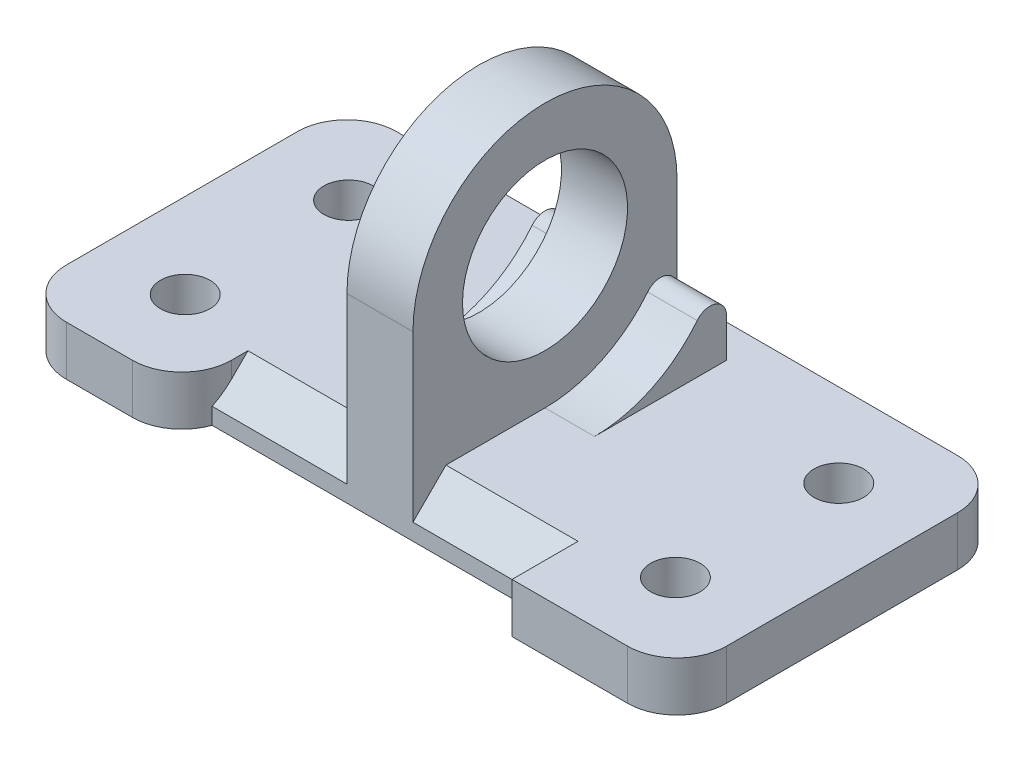
ISO-10303-21;
HEADER;
FILE_DESCRIPTION(('STEP AP214'),'2;1');
FILE_NAME('part.step','',(''),(''),'','','');
FILE_SCHEMA(('AUTOMOTIVE_DESIGN { 1 0 10303 214 1 1 1 1 }'));
ENDSEC;
DATA;
#1=APPLICATION_CONTEXT('core data for automotive mechanical design processes');
#2=APPLICATION_PROTOCOL_DEFINITION('international standard','automotive_design',2000,#1);
#3=PRODUCT_CONTEXT('',#1,'mechanical');
#4=PRODUCT('Part','Part','',(#3));
#5=PRODUCT_RELATED_PRODUCT_CATEGORY('part','',(#4));
#6=PRODUCT_DEFINITION_FORMATION('','',#4);
#7=PRODUCT_DEFINITION_CONTEXT('part definition',#1,'design');
#8=PRODUCT_DEFINITION('design','',#6,#7);
#9=PRODUCT_DEFINITION_SHAPE('','',#8);
#10=(LENGTH_UNIT() NAMED_UNIT(*) SI_UNIT(.MILLI.,.METRE.));
#11=(NAMED_UNIT(*) PLANE_ANGLE_UNIT() SI_UNIT($,.RADIAN.));
#12=(NAMED_UNIT(*) SI_UNIT($,.STERADIAN.) SOLID_ANGLE_UNIT());
#13=UNCERTAINTY_MEASURE_WITH_UNIT(LENGTH_MEASURE(1.E-05),#10,'distance_accuracy_value','');
#14=(GEOMETRIC_REPRESENTATION_CONTEXT(3) GLOBAL_UNCERTAINTY_ASSIGNED_CONTEXT((#13)) GLOBAL_UNIT_ASSIGNED_CONTEXT((#10,
#11,#12)) REPRESENTATION_CONTEXT('',''));
#15=CARTESIAN_POINT('',(0.,0.,0.));
#16=DIRECTION('',(0.,0.,1.));
#17=DIRECTION('',(1.,0.,0.));
#18=AXIS2_PLACEMENT_3D('',#15,#16,#17);
#19=CARTESIAN_POINT('',(0.,0.,10.));
#20=DIRECTION('',(0.,0.,1.));
#21=DIRECTION('',(1.,0.,0.));
#22=AXIS2_PLACEMENT_3D('',#19,#20,#21);
#23=PLANE('',#22);
#24=DIRECTION('',(-1.,0.,0.));
#25=VECTOR('',#24,1.);
#26=CARTESIAN_POINT('',(-18.,3.,10.));
#27=LINE('',#26,#25);
#28=CARTESIAN_POINT('',(-13.,3.,10.));
#29=VERTEX_POINT('',#28);
#30=CARTESIAN_POINT('',(-17.,3.,10.));
#31=VERTEX_POINT('',#30);
#32=EDGE_CURVE('E216',#29,#31,#27,.T.);
#33=ORIENTED_EDGE('',*,*,#32,.T.);
#34=DIRECTION('',(0.,1.,0.));
#35=VECTOR('',#34,1.);
#36=CARTESIAN_POINT('',(-17.,0.,10.));
#37=LINE('',#36,#35);
#38=CARTESIAN_POINT('',(-17.,0.,10.));
#39=VERTEX_POINT('',#38);
#40=EDGE_CURVE('E423',#31,#39,#37,.F.);
#41=ORIENTED_EDGE('',*,*,#40,.T.);
#42=DIRECTION('',(1.,0.,0.));
#43=VECTOR('',#42,1.);
#44=CARTESIAN_POINT('',(-18.,0.,10.));
#45=LINE('',#44,#43);
#46=CARTESIAN_POINT('',(-13.,0.,10.));
#47=VERTEX_POINT('',#46);
#48=EDGE_CURVE('E265',#39,#47,#45,.T.);
#49=ORIENTED_EDGE('',*,*,#48,.T.);
#50=DIRECTION('',(0.,-1.,0.));
#51=VECTOR('',#50,1.);
#52=CARTESIAN_POINT('',(-13.,3.,10.));
#53=LINE('',#52,#51);
#54=EDGE_CURVE('E421',#47,#29,#53,.F.);
#55=ORIENTED_EDGE('',*,*,#54,.T.);
#56=EDGE_LOOP('',(#33,#41,#49,#55));
#57=FACE_BOUND('',#56,.T.);
#58=ADVANCED_FACE('F37',(#57),#23,.T.);
#59=CARTESIAN_POINT('',(-18.,3.,-8.));
#60=DIRECTION('',(0.,0.,-1.));
#61=DIRECTION('',(-1.,0.,0.));
#62=AXIS2_PLACEMENT_3D('',#59,#60,#61);
#63=PLANE('',#62);
#64=DIRECTION('',(0.,-1.,0.));
#65=VECTOR('',#64,1.);
#66=CARTESIAN_POINT('',(5.,0.,-8.));
#67=LINE('',#66,#65);
#68=CARTESIAN_POINT('',(5.,5.34314575050762,-8.));
#69=VERTEX_POINT('',#68);
#70=CARTESIAN_POINT('',(5.,3.,-8.));
#71=VERTEX_POINT('',#70);
#72=EDGE_CURVE('E302',#69,#71,#67,.T.);
#73=ORIENTED_EDGE('',*,*,#72,.T.);
#74=DIRECTION('',(1.,0.,0.));
#75=VECTOR('',#74,1.);
#76=CARTESIAN_POINT('',(-18.,3.,-8.));
#77=LINE('',#76,#75);
#78=CARTESIAN_POINT('',(-5.,3.,-8.));
#79=VERTEX_POINT('',#78);
#80=EDGE_CURVE('E256',#79,#71,#77,.T.);
#81=ORIENTED_EDGE('',*,*,#80,.F.);
#82=DIRECTION('',(0.,-1.,0.));
#83=VECTOR('',#82,1.);
#84=CARTESIAN_POINT('',(-5.,0.,-8.));
#85=LINE('',#84,#83);
#86=CARTESIAN_POINT('',(-5.,5.34314575050762,-8.));
#87=VERTEX_POINT('',#86);
#88=EDGE_CURVE('E313',#87,#79,#85,.T.);
#89=ORIENTED_EDGE('',*,*,#88,.F.);
#90=DIRECTION('',(1.,0.,0.));
#91=VECTOR('',#90,1.);
#92=CARTESIAN_POINT('',(-18.,5.34314575050762,-8.));
#93=LINE('',#92,#91);
#94=CARTESIAN_POINT('',(-2.,5.34314575050762,-8.));
#95=VERTEX_POINT('',#94);
#96=EDGE_CURVE('E340',#87,#95,#93,.T.);
#97=ORIENTED_EDGE('',*,*,#96,.T.);
#98=DIRECTION('',(0.,1.,0.));
#99=VECTOR('',#98,1.);
#100=CARTESIAN_POINT('',(-2.,19.,-8.));
#101=LINE('',#100,#99);
#102=CARTESIAN_POINT('',(-2.,11.,-8.));
#103=VERTEX_POINT('',#102);
#104=EDGE_CURVE('E338',#95,#103,#101,.T.);
#105=ORIENTED_EDGE('',*,*,#104,.T.);
#106=DIRECTION('',(-1.,0.,0.));
#107=VECTOR('',#106,1.);
#108=CARTESIAN_POINT('',(18.,11.,-8.));
#109=LINE('',#108,#107);
#110=CARTESIAN_POINT('',(2.,11.,-8.));
#111=VERTEX_POINT('',#110);
#112=EDGE_CURVE('E288',#111,#103,#109,.T.);
#113=ORIENTED_EDGE('',*,*,#112,.F.);
#114=DIRECTION('',(0.,-1.,0.));
#115=VECTOR('',#114,1.);
#116=CARTESIAN_POINT('',(2.,19.,-8.));
#117=LINE('',#116,#115);
#118=CARTESIAN_POINT('',(2.,5.34314575050762,-8.));
#119=VERTEX_POINT('',#118);
#120=EDGE_CURVE('E345',#111,#119,#117,.T.);
#121=ORIENTED_EDGE('',*,*,#120,.T.);
#122=DIRECTION('',(1.,0.,0.));
#123=VECTOR('',#122,1.);
#124=CARTESIAN_POINT('',(5.,5.34314575050762,-8.));
#125=LINE('',#124,#123);
#126=EDGE_CURVE('E343',#119,#69,#125,.T.);
#127=ORIENTED_EDGE('',*,*,#126,.T.);
#128=EDGE_LOOP('',(#73,#81,#89,#97,#105,#113,#121,#127));
#129=FACE_BOUND('',#128,.T.);
#130=ADVANCED_FACE('F484',(#129),#63,.T.);
#131=CARTESIAN_POINT('',(-18.,3.,8.));
#132=DIRECTION('',(0.,0.,-1.));
#133=DIRECTION('',(-1.,0.,0.));
#134=AXIS2_PLACEMENT_3D('',#131,#132,#133);
#135=PLANE('',#134);
#136=DIRECTION('',(0.,1.,0.));
#137=VECTOR('',#136,1.);
#138=CARTESIAN_POINT('',(10.,-3.,8.));
#139=LINE('',#138,#137);
#140=CARTESIAN_POINT('',(10.,0.,8.));
#141=VERTEX_POINT('',#140);
#142=CARTESIAN_POINT('',(10.,0.999999999999998,8.));
#143=VERTEX_POINT('',#142);
#144=EDGE_CURVE('E235',#141,#143,#139,.T.);
#145=ORIENTED_EDGE('',*,*,#144,.T.);
#146=DIRECTION('',(-1.,0.,0.));
#147=VECTOR('',#146,1.);
#148=CARTESIAN_POINT('',(-18.,0.999999999999998,8.));
#149=LINE('',#148,#147);
#150=CARTESIAN_POINT('',(2.,0.999999999999997,8.));
#151=VERTEX_POINT('',#150);
#152=EDGE_CURVE('E369',#143,#151,#149,.T.);
#153=ORIENTED_EDGE('',*,*,#152,.T.);
#154=DIRECTION('',(0.,-1.,0.));
#155=VECTOR('',#154,1.);
#156=CARTESIAN_POINT('',(2.,19.,8.));
#157=LINE('',#156,#155);
#158=CARTESIAN_POINT('',(2.,11.,8.));
#159=VERTEX_POINT('',#158);
#160=EDGE_CURVE('E328',#159,#151,#157,.T.);
#161=ORIENTED_EDGE('',*,*,#160,.F.);
#162=DIRECTION('',(-1.,0.,0.));
#163=VECTOR('',#162,1.);
#164=CARTESIAN_POINT('',(18.,11.,8.));
#165=LINE('',#164,#163);
#166=CARTESIAN_POINT('',(-2.,11.,8.));
#167=VERTEX_POINT('',#166);
#168=EDGE_CURVE('E332',#159,#167,#165,.T.);
#169=ORIENTED_EDGE('',*,*,#168,.T.);
#170=DIRECTION('',(0.,-1.,0.));
#171=VECTOR('',#170,1.);
#172=CARTESIAN_POINT('',(-2.,19.,8.));
#173=LINE('',#172,#171);
#174=CARTESIAN_POINT('',(-2.,0.999999999999997,8.));
#175=VERTEX_POINT('',#174);
#176=EDGE_CURVE('E330',#167,#175,#173,.T.);
#177=ORIENTED_EDGE('',*,*,#176,.T.);
#178=DIRECTION('',(-1.,0.,0.));
#179=VECTOR('',#178,1.);
#180=CARTESIAN_POINT('',(-18.,0.999999999999998,8.));
#181=LINE('',#180,#179);
#182=CARTESIAN_POINT('',(-10.1715728752538,0.999999999999998,8.));
#183=VERTEX_POINT('',#182);
#184=EDGE_CURVE('E51',#175,#183,#181,.T.);
#185=ORIENTED_EDGE('',*,*,#184,.T.);
#186=DIRECTION('',(0.,1.,0.));
#187=VECTOR('',#186,1.);
#188=CARTESIAN_POINT('',(-10.1715728752538,0.999999999999998,8.));
#189=LINE('',#188,#187);
#190=CARTESIAN_POINT('',(-10.1715728752538,0.,8.));
#191=VERTEX_POINT('',#190);
#192=EDGE_CURVE('E11',#183,#191,#189,.F.);
#193=ORIENTED_EDGE('',*,*,#192,.T.);
#194=DIRECTION('',(1.,0.,0.));
#195=VECTOR('',#194,1.);
#196=CARTESIAN_POINT('',(0.,0.,8.));
#197=LINE('',#196,#195);
#198=EDGE_CURVE('E225',#191,#141,#197,.T.);
#199=ORIENTED_EDGE('',*,*,#198,.T.);
#200=EDGE_LOOP('',(#145,#153,#161,#169,#177,#185,#193,#199));
#201=FACE_BOUND('',#200,.T.);
#202=ADVANCED_FACE('F434',(#201),#135,.F.);
#203=CARTESIAN_POINT('',(2.,19.,8.));
#204=DIRECTION('',(-1.,0.,0.));
#205=DIRECTION('',(0.,0.,1.));
#206=AXIS2_PLACEMENT_3D('',#203,#204,#205);
#207=PLANE('',#206);
#208=CARTESIAN_POINT('',(2.,11.,0.));
#209=DIRECTION('',(-1.,0.,0.));
#210=DIRECTION('',(0.,0.,1.));
#211=AXIS2_PLACEMENT_3D('',#208,#209,#210);
#212=CIRCLE('',#211,5.);
#213=CARTESIAN_POINT('',(2.,11.,5.));
#214=VERTEX_POINT('',#213);
#215=EDGE_CURVE('E284',#214,#214,#212,.T.);
#216=ORIENTED_EDGE('',*,*,#215,.T.);
#217=EDGE_LOOP('',(#216));
#218=FACE_BOUND('',#217,.T.);
#219=CARTESIAN_POINT('',(2.,11.,0.));
#220=DIRECTION('',(-1.,0.,0.));
#221=DIRECTION('',(0.,0.,1.));
#222=AXIS2_PLACEMENT_3D('',#219,#220,#221);
#223=CIRCLE('',#222,8.);
#224=EDGE_CURVE('E293',#159,#111,#223,.T.);
#225=ORIENTED_EDGE('',*,*,#224,.F.);
#226=ORIENTED_EDGE('',*,*,#160,.T.);
#227=DIRECTION('',(0.,-0.707106781186546,0.707106781186549));
#228=VECTOR('',#227,1.);
#229=CARTESIAN_POINT('',(2.,9.99999999999997,-1.));
#230=LINE('',#229,#228);
#231=CARTESIAN_POINT('',(2.,3.,5.99999999999999));
#232=VERTEX_POINT('',#231);
#233=EDGE_CURVE('E375',#151,#232,#230,.F.);
#234=ORIENTED_EDGE('',*,*,#233,.T.);
#235=DIRECTION('',(0.,0.,-1.));
#236=VECTOR('',#235,1.);
#237=CARTESIAN_POINT('',(2.,3.,8.));
#238=LINE('',#237,#236);
#239=CARTESIAN_POINT('',(2.,3.,0.));
#240=VERTEX_POINT('',#239);
#241=EDGE_CURVE('E326',#232,#240,#238,.T.);
#242=ORIENTED_EDGE('',*,*,#241,.T.);
#243=CARTESIAN_POINT('',(2.,11.,0.));
#244=DIRECTION('',(-1.,0.,0.));
#245=DIRECTION('',(0.,0.,1.));
#246=AXIS2_PLACEMENT_3D('',#243,#244,#245);
#247=CIRCLE('',#246,8.);
#248=CARTESIAN_POINT('',(2.,5.97168511156233,-6.22222222222222));
#249=VERTEX_POINT('',#248);
#250=EDGE_CURVE('E296',#249,#240,#247,.T.);
#251=ORIENTED_EDGE('',*,*,#250,.F.);
#252=CARTESIAN_POINT('',(2.,5.34314575050762,-7.));
#253=DIRECTION('',(-1.,0.,0.));
#254=DIRECTION('',(0.,0.,1.));
#255=AXIS2_PLACEMENT_3D('',#252,#253,#254);
#256=CIRCLE('',#255,1.);
#257=EDGE_CURVE('E354',#249,#119,#256,.T.);
#258=ORIENTED_EDGE('',*,*,#257,.T.);
#259=ORIENTED_EDGE('',*,*,#120,.F.);
#260=EDGE_LOOP('',(#225,#226,#234,#242,#251,#258,#259));
#261=FACE_BOUND('',#260,.T.);
#262=ADVANCED_FACE('F540',(#218,#261),#207,.F.);
#263=CARTESIAN_POINT('',(-2.,19.,8.));
#264=DIRECTION('',(1.,0.,0.));
#265=DIRECTION('',(0.,0.,-1.));
#266=AXIS2_PLACEMENT_3D('',#263,#264,#265);
#267=PLANE('',#266);
#268=CARTESIAN_POINT('',(-2.,11.,0.));
#269=DIRECTION('',(-1.,0.,0.));
#270=DIRECTION('',(0.,0.,1.));
#271=AXIS2_PLACEMENT_3D('',#268,#269,#270);
#272=CIRCLE('',#271,5.);
#273=CARTESIAN_POINT('',(-2.,11.,5.));
#274=VERTEX_POINT('',#273);
#275=EDGE_CURVE('E281',#274,#274,#272,.T.);
#276=ORIENTED_EDGE('',*,*,#275,.F.);
#277=EDGE_LOOP('',(#276));
#278=FACE_BOUND('',#277,.T.);
#279=ORIENTED_EDGE('',*,*,#176,.F.);
#280=CARTESIAN_POINT('',(-2.,11.,0.));
#281=DIRECTION('',(1.,0.,0.));
#282=DIRECTION('',(0.,0.,-1.));
#283=AXIS2_PLACEMENT_3D('',#280,#281,#282);
#284=CIRCLE('',#283,8.);
#285=EDGE_CURVE('E291',#103,#167,#284,.T.);
#286=ORIENTED_EDGE('',*,*,#285,.F.);
#287=ORIENTED_EDGE('',*,*,#104,.F.);
#288=CARTESIAN_POINT('',(-2.,5.34314575050762,-7.));
#289=DIRECTION('',(1.,0.,0.));
#290=DIRECTION('',(0.,0.,-1.));
#291=AXIS2_PLACEMENT_3D('',#288,#289,#290);
#292=CIRCLE('',#291,1.);
#293=CARTESIAN_POINT('',(-2.,5.97168511156233,-6.22222222222222));
#294=VERTEX_POINT('',#293);
#295=EDGE_CURVE('E226',#95,#294,#292,.T.);
#296=ORIENTED_EDGE('',*,*,#295,.T.);
#297=CARTESIAN_POINT('',(-2.,11.,0.));
#298=DIRECTION('',(-1.,0.,0.));
#299=DIRECTION('',(0.,0.,1.));
#300=AXIS2_PLACEMENT_3D('',#297,#298,#299);
#301=CIRCLE('',#300,8.);
#302=CARTESIAN_POINT('',(-2.,3.,0.));
#303=VERTEX_POINT('',#302);
#304=EDGE_CURVE('E310',#294,#303,#301,.T.);
#305=ORIENTED_EDGE('',*,*,#304,.T.);
#306=DIRECTION('',(0.,0.,1.));
#307=VECTOR('',#306,1.);
#308=CARTESIAN_POINT('',(-2.,3.,8.));
#309=LINE('',#308,#307);
#310=CARTESIAN_POINT('',(-2.,3.,5.99999999999999));
#311=VERTEX_POINT('',#310);
#312=EDGE_CURVE('E323',#303,#311,#309,.T.);
#313=ORIENTED_EDGE('',*,*,#312,.T.);
#314=DIRECTION('',(0.,0.707106781186546,-0.707106781186549));
#315=VECTOR('',#314,1.);
#316=CARTESIAN_POINT('',(-2.,9.99999999999997,-1.));
#317=LINE('',#316,#315);
#318=EDGE_CURVE('E381',#311,#175,#317,.F.);
#319=ORIENTED_EDGE('',*,*,#318,.T.);
#320=EDGE_LOOP('',(#279,#286,#287,#296,#305,#313,#319));
#321=FACE_BOUND('',#320,.T.);
#322=ADVANCED_FACE('F543',(#278,#321),#267,.F.);
#323=CARTESIAN_POINT('',(0.,3.,0.));
#324=DIRECTION('',(0.,-1.,0.));
#325=DIRECTION('',(0.,0.,-1.));
#326=AXIS2_PLACEMENT_3D('',#323,#324,#325);
#327=PLANE('',#326);
#328=CARTESIAN_POINT('',(14.85,3.,4.95));
#329=DIRECTION('',(0.,1.,0.));
#330=DIRECTION('',(0.,0.,1.));
#331=AXIS2_PLACEMENT_3D('',#328,#329,#330);
#332=CIRCLE('',#331,1.5);
#333=CARTESIAN_POINT('',(14.85,3.,6.45));
#334=VERTEX_POINT('',#333);
#335=EDGE_CURVE('E273',#334,#334,#332,.T.);
#336=ORIENTED_EDGE('',*,*,#335,.F.);
#337=EDGE_LOOP('',(#336));
#338=FACE_BOUND('',#337,.T.);
#339=CARTESIAN_POINT('',(14.85,3.,-4.95));
#340=DIRECTION('',(0.,1.,0.));
#341=DIRECTION('',(0.,0.,-1.));
#342=AXIS2_PLACEMENT_3D('',#339,#340,#341);
#343=CIRCLE('',#342,1.5);
#344=CARTESIAN_POINT('',(14.85,3.,-6.45));
#345=VERTEX_POINT('',#344);
#346=EDGE_CURVE('E269',#345,#345,#343,.T.);
#347=ORIENTED_EDGE('',*,*,#346,.F.);
#348=EDGE_LOOP('',(#347));
#349=FACE_BOUND('',#348,.T.);
#350=DIRECTION('',(1.,0.,0.));
#351=VECTOR('',#350,1.);
#352=CARTESIAN_POINT('',(-18.,3.,-10.));
#353=LINE('',#352,#351);
#354=CARTESIAN_POINT('',(-17.,3.,-10.));
#355=VERTEX_POINT('',#354);
#356=CARTESIAN_POINT('',(17.,3.,-10.));
#357=VERTEX_POINT('',#356);
#358=EDGE_CURVE('E257',#355,#357,#353,.T.);
#359=ORIENTED_EDGE('',*,*,#358,.F.);
#360=CARTESIAN_POINT('',(-17.,3.,-7.));
#361=DIRECTION('',(0.,-1.,0.));
#362=DIRECTION('',(0.,0.,-1.));
#363=AXIS2_PLACEMENT_3D('',#360,#361,#362);
#364=CIRCLE('',#363,3.);
#365=CARTESIAN_POINT('',(-20.,3.,-7.));
#366=VERTEX_POINT('',#365);
#367=EDGE_CURVE('E412',#355,#366,#364,.F.);
#368=ORIENTED_EDGE('',*,*,#367,.T.);
#369=DIRECTION('',(0.,0.,-1.));
#370=VECTOR('',#369,1.);
#371=CARTESIAN_POINT('',(-20.,3.,10.));
#372=LINE('',#371,#370);
#373=CARTESIAN_POINT('',(-20.,3.,7.));
#374=VERTEX_POINT('',#373);
#375=EDGE_CURVE('E253',#374,#366,#372,.T.);
#376=ORIENTED_EDGE('',*,*,#375,.F.);
#377=CARTESIAN_POINT('',(-17.,3.,7.));
#378=DIRECTION('',(0.,-1.,0.));
#379=DIRECTION('',(0.,0.,-1.));
#380=AXIS2_PLACEMENT_3D('',#377,#378,#379);
#381=CIRCLE('',#380,3.);
#382=EDGE_CURVE('E406',#374,#31,#381,.F.);
#383=ORIENTED_EDGE('',*,*,#382,.T.);
#384=ORIENTED_EDGE('',*,*,#32,.F.);
#385=CARTESIAN_POINT('',(-13.,3.,7.));
#386=DIRECTION('',(0.,-1.,0.));
#387=DIRECTION('',(0.,0.,-1.));
#388=AXIS2_PLACEMENT_3D('',#385,#386,#387);
#389=CIRCLE('',#388,3.);
#390=CARTESIAN_POINT('',(-10.,3.,7.));
#391=VERTEX_POINT('',#390);
#392=EDGE_CURVE('E404',#29,#391,#389,.F.);
#393=ORIENTED_EDGE('',*,*,#392,.T.);
#394=DIRECTION('',(0.,0.,1.));
#395=VECTOR('',#394,1.);
#396=CARTESIAN_POINT('',(-10.,3.,12.));
#397=LINE('',#396,#395);
#398=CARTESIAN_POINT('',(-10.,3.,5.99999999999999));
#399=VERTEX_POINT('',#398);
#400=EDGE_CURVE('E236',#399,#391,#397,.T.);
#401=ORIENTED_EDGE('',*,*,#400,.F.);
#402=DIRECTION('',(1.,0.,0.));
#403=VECTOR('',#402,1.);
#404=CARTESIAN_POINT('',(0.,3.,5.99999999999999));
#405=LINE('',#404,#403);
#406=EDGE_CURVE('E372',#399,#311,#405,.T.);
#407=ORIENTED_EDGE('',*,*,#406,.T.);
#408=ORIENTED_EDGE('',*,*,#312,.F.);
#409=DIRECTION('',(1.,0.,0.));
#410=VECTOR('',#409,1.);
#411=CARTESIAN_POINT('',(-5.,3.,0.));
#412=LINE('',#411,#410);
#413=CARTESIAN_POINT('',(-5.,3.,0.));
#414=VERTEX_POINT('',#413);
#415=EDGE_CURVE('E319',#414,#303,#412,.T.);
#416=ORIENTED_EDGE('',*,*,#415,.F.);
#417=DIRECTION('',(0.,0.,1.));
#418=VECTOR('',#417,1.);
#419=CARTESIAN_POINT('',(-5.,3.,0.));
#420=LINE('',#419,#418);
#421=EDGE_CURVE('E316',#79,#414,#420,.T.);
#422=ORIENTED_EDGE('',*,*,#421,.F.);
#423=ORIENTED_EDGE('',*,*,#80,.T.);
#424=DIRECTION('',(0.,0.,1.));
#425=VECTOR('',#424,1.);
#426=CARTESIAN_POINT('',(5.,3.,0.));
#427=LINE('',#426,#425);
#428=CARTESIAN_POINT('',(5.,3.,0.));
#429=VERTEX_POINT('',#428);
#430=EDGE_CURVE('E299',#71,#429,#427,.T.);
#431=ORIENTED_EDGE('',*,*,#430,.T.);
#432=DIRECTION('',(-1.,0.,0.));
#433=VECTOR('',#432,1.);
#434=CARTESIAN_POINT('',(5.,3.,0.));
#435=LINE('',#434,#433);
#436=EDGE_CURVE('E305',#429,#240,#435,.T.);
#437=ORIENTED_EDGE('',*,*,#436,.T.);
#438=ORIENTED_EDGE('',*,*,#241,.F.);
#439=DIRECTION('',(1.,0.,0.));
#440=VECTOR('',#439,1.);
#441=CARTESIAN_POINT('',(0.,3.,5.99999999999999));
#442=LINE('',#441,#440);
#443=CARTESIAN_POINT('',(10.,3.,5.99999999999999));
#444=VERTEX_POINT('',#443);
#445=EDGE_CURVE('E233',#232,#444,#442,.T.);
#446=ORIENTED_EDGE('',*,*,#445,.T.);
#447=DIRECTION('',(0.,0.,-1.));
#448=VECTOR('',#447,1.);
#449=CARTESIAN_POINT('',(10.,3.,12.));
#450=LINE('',#449,#448);
#451=CARTESIAN_POINT('',(10.,3.,10.));
#452=VERTEX_POINT('',#451);
#453=EDGE_CURVE('E220',#452,#444,#450,.T.);
#454=ORIENTED_EDGE('',*,*,#453,.F.);
#455=CARTESIAN_POINT('',(17.,3.,10.));
#456=VERTEX_POINT('',#455);
#457=EDGE_CURVE('E204',#456,#452,#27,.T.);
#458=ORIENTED_EDGE('',*,*,#457,.F.);
#459=CARTESIAN_POINT('',(17.,3.,7.));
#460=DIRECTION('',(0.,-1.,0.));
#461=DIRECTION('',(0.,0.,-1.));
#462=AXIS2_PLACEMENT_3D('',#459,#460,#461);
#463=CIRCLE('',#462,3.);
#464=CARTESIAN_POINT('',(20.,3.,7.));
#465=VERTEX_POINT('',#464);
#466=EDGE_CURVE('E408',#456,#465,#463,.F.);
#467=ORIENTED_EDGE('',*,*,#466,.T.);
#468=DIRECTION('',(0.,0.,1.));
#469=VECTOR('',#468,1.);
#470=CARTESIAN_POINT('',(20.,3.,-10.));
#471=LINE('',#470,#469);
#472=CARTESIAN_POINT('',(20.,3.,-7.));
#473=VERTEX_POINT('',#472);
#474=EDGE_CURVE('E247',#473,#465,#471,.T.);
#475=ORIENTED_EDGE('',*,*,#474,.F.);
#476=CARTESIAN_POINT('',(17.,3.,-7.));
#477=DIRECTION('',(0.,-1.,0.));
#478=DIRECTION('',(0.,0.,-1.));
#479=AXIS2_PLACEMENT_3D('',#476,#477,#478);
#480=CIRCLE('',#479,3.);
#481=EDGE_CURVE('E410',#473,#357,#480,.F.);
#482=ORIENTED_EDGE('',*,*,#481,.T.);
#483=EDGE_LOOP('',(#359,#368,#376,#383,#384,#393,#401,#407,#408,#416,#422,#423,#431,#437,#438,
#446,#454,#458,#467,#475,#482));
#484=FACE_BOUND('',#483,.T.);
#485=CARTESIAN_POINT('',(-14.85,3.,4.95));
#486=DIRECTION('',(0.,1.,0.));
#487=DIRECTION('',(0.,0.,-1.));
#488=AXIS2_PLACEMENT_3D('',#485,#486,#487);
#489=CIRCLE('',#488,1.5);
#490=CARTESIAN_POINT('',(-14.85,3.,3.45));
#491=VERTEX_POINT('',#490);
#492=EDGE_CURVE('E215',#491,#491,#489,.T.);
#493=ORIENTED_EDGE('',*,*,#492,.F.);
#494=EDGE_LOOP('',(#493));
#495=FACE_BOUND('',#494,.T.);
#496=CARTESIAN_POINT('',(-14.85,3.,-4.95));
#497=DIRECTION('',(0.,1.,0.));
#498=DIRECTION('',(0.,0.,1.));
#499=AXIS2_PLACEMENT_3D('',#496,#497,#498);
#500=CIRCLE('',#499,1.5);
#501=CARTESIAN_POINT('',(-14.85,3.,-3.45));
#502=VERTEX_POINT('',#501);
#503=EDGE_CURVE('E272',#502,#502,#500,.T.);
#504=ORIENTED_EDGE('',*,*,#503,.F.);
#505=EDGE_LOOP('',(#504));
#506=FACE_BOUND('',#505,.T.);
#507=ADVANCED_FACE('F229',(#338,#349,#484,#495,#506),#327,.F.);
#508=CARTESIAN_POINT('',(0.,0.,0.));
#509=DIRECTION('',(0.,-1.,0.));
#510=DIRECTION('',(0.,0.,-1.));
#511=AXIS2_PLACEMENT_3D('',#508,#509,#510);
#512=PLANE('',#511);
#513=DIRECTION('',(0.,0.,1.));
#514=VECTOR('',#513,1.);
#515=CARTESIAN_POINT('',(-20.,0.,-10.));
#516=LINE('',#515,#514);
#517=CARTESIAN_POINT('',(-20.,0.,-7.));
#518=VERTEX_POINT('',#517);
#519=CARTESIAN_POINT('',(-20.,0.,7.));
#520=VERTEX_POINT('',#519);
#521=EDGE_CURVE('E250',#518,#520,#516,.T.);
#522=ORIENTED_EDGE('',*,*,#521,.F.);
#523=CARTESIAN_POINT('',(-17.,0.,-7.));
#524=DIRECTION('',(0.,-1.,0.));
#525=DIRECTION('',(0.,0.,-1.));
#526=AXIS2_PLACEMENT_3D('',#523,#524,#525);
#527=CIRCLE('',#526,3.);
#528=CARTESIAN_POINT('',(-17.,0.,-10.));
#529=VERTEX_POINT('',#528);
#530=EDGE_CURVE('E398',#518,#529,#527,.T.);
#531=ORIENTED_EDGE('',*,*,#530,.T.);
#532=DIRECTION('',(-1.,0.,0.));
#533=VECTOR('',#532,1.);
#534=CARTESIAN_POINT('',(-18.,0.,-10.));
#535=LINE('',#534,#533);
#536=CARTESIAN_POINT('',(17.,0.,-10.));
#537=VERTEX_POINT('',#536);
#538=EDGE_CURVE('E260',#537,#529,#535,.T.);
#539=ORIENTED_EDGE('',*,*,#538,.F.);
#540=CARTESIAN_POINT('',(17.,0.,-7.));
#541=DIRECTION('',(0.,-1.,0.));
#542=DIRECTION('',(0.,0.,-1.));
#543=AXIS2_PLACEMENT_3D('',#540,#541,#542);
#544=CIRCLE('',#543,3.);
#545=CARTESIAN_POINT('',(20.,0.,-7.));
#546=VERTEX_POINT('',#545);
#547=EDGE_CURVE('E396',#537,#546,#544,.T.);
#548=ORIENTED_EDGE('',*,*,#547,.T.);
#549=DIRECTION('',(0.,0.,-1.));
#550=VECTOR('',#549,1.);
#551=CARTESIAN_POINT('',(20.,0.,10.));
#552=LINE('',#551,#550);
#553=CARTESIAN_POINT('',(20.,0.,7.));
#554=VERTEX_POINT('',#553);
#555=EDGE_CURVE('E244',#554,#546,#552,.T.);
#556=ORIENTED_EDGE('',*,*,#555,.F.);
#557=CARTESIAN_POINT('',(17.,0.,7.));
#558=DIRECTION('',(0.,-1.,0.));
#559=DIRECTION('',(0.,0.,-1.));
#560=AXIS2_PLACEMENT_3D('',#557,#558,#559);
#561=CIRCLE('',#560,3.);
#562=CARTESIAN_POINT('',(17.,0.,10.));
#563=VERTEX_POINT('',#562);
#564=EDGE_CURVE('E394',#554,#563,#561,.T.);
#565=ORIENTED_EDGE('',*,*,#564,.T.);
#566=CARTESIAN_POINT('',(10.,0.,10.));
#567=VERTEX_POINT('',#566);
#568=EDGE_CURVE('E263',#567,#563,#45,.T.);
#569=ORIENTED_EDGE('',*,*,#568,.F.);
#570=DIRECTION('',(0.,0.,1.));
#571=VECTOR('',#570,1.);
#572=CARTESIAN_POINT('',(10.,0.,0.));
#573=LINE('',#572,#571);
#574=EDGE_CURVE('E224',#141,#567,#573,.T.);
#575=ORIENTED_EDGE('',*,*,#574,.F.);
#576=ORIENTED_EDGE('',*,*,#198,.F.);
#577=CARTESIAN_POINT('',(-13.,0.,7.));
#578=DIRECTION('',(0.,-1.,0.));
#579=DIRECTION('',(0.,0.,-1.));
#580=AXIS2_PLACEMENT_3D('',#577,#578,#579);
#581=CIRCLE('',#580,3.);
#582=EDGE_CURVE('E390',#191,#47,#581,.T.);
#583=ORIENTED_EDGE('',*,*,#582,.T.);
#584=ORIENTED_EDGE('',*,*,#48,.F.);
#585=CARTESIAN_POINT('',(-17.,0.,7.));
#586=DIRECTION('',(0.,-1.,0.));
#587=DIRECTION('',(0.,0.,-1.));
#588=AXIS2_PLACEMENT_3D('',#585,#586,#587);
#589=CIRCLE('',#588,3.);
#590=EDGE_CURVE('E392',#39,#520,#589,.T.);
#591=ORIENTED_EDGE('',*,*,#590,.T.);
#592=EDGE_LOOP('',(#522,#531,#539,#548,#556,#565,#569,#575,#576,#583,#584,#591));
#593=FACE_BOUND('',#592,.T.);
#594=CARTESIAN_POINT('',(-14.85,0.,4.95));
#595=DIRECTION('',(0.,-1.,0.));
#596=DIRECTION('',(0.,0.,-1.));
#597=AXIS2_PLACEMENT_3D('',#594,#595,#596);
#598=CIRCLE('',#597,1.5);
#599=CARTESIAN_POINT('',(-14.85,0.,3.45));
#600=VERTEX_POINT('',#599);
#601=EDGE_CURVE('E285',#600,#600,#598,.T.);
#602=ORIENTED_EDGE('',*,*,#601,.F.);
#603=EDGE_LOOP('',(#602));
#604=FACE_BOUND('',#603,.T.);
#605=CARTESIAN_POINT('',(14.85,0.,4.95));
#606=DIRECTION('',(0.,-1.,0.));
#607=DIRECTION('',(0.,0.,-1.));
#608=AXIS2_PLACEMENT_3D('',#605,#606,#607);
#609=CIRCLE('',#608,1.5);
#610=CARTESIAN_POINT('',(14.85,0.,3.45));
#611=VERTEX_POINT('',#610);
#612=EDGE_CURVE('E362',#611,#611,#609,.T.);
#613=ORIENTED_EDGE('',*,*,#612,.F.);
#614=EDGE_LOOP('',(#613));
#615=FACE_BOUND('',#614,.T.);
#616=CARTESIAN_POINT('',(14.85,0.,-4.95));
#617=DIRECTION('',(0.,-1.,0.));
#618=DIRECTION('',(0.,0.,-1.));
#619=AXIS2_PLACEMENT_3D('',#616,#617,#618);
#620=CIRCLE('',#619,1.5);
#621=CARTESIAN_POINT('',(14.85,0.,-6.45));
#622=VERTEX_POINT('',#621);
#623=EDGE_CURVE('E359',#622,#622,#620,.T.);
#624=ORIENTED_EDGE('',*,*,#623,.F.);
#625=EDGE_LOOP('',(#624));
#626=FACE_BOUND('',#625,.T.);
#627=CARTESIAN_POINT('',(-14.85,0.,-4.95));
#628=DIRECTION('',(0.,-1.,0.));
#629=DIRECTION('',(0.,0.,-1.));
#630=AXIS2_PLACEMENT_3D('',#627,#628,#629);
#631=CIRCLE('',#630,1.5);
#632=CARTESIAN_POINT('',(-14.85,0.,-6.45));
#633=VERTEX_POINT('',#632);
#634=EDGE_CURVE('E280',#633,#633,#631,.T.);
#635=ORIENTED_EDGE('',*,*,#634,.F.);
#636=EDGE_LOOP('',(#635));
#637=FACE_BOUND('',#636,.T.);
#638=ADVANCED_FACE('F438',(#593,#604,#615,#626,#637),#512,.T.);
#639=CARTESIAN_POINT('',(-5.,11.,0.));
#640=DIRECTION('',(1.,0.,0.));
#641=DIRECTION('',(0.,0.,-1.));
#642=AXIS2_PLACEMENT_3D('',#639,#640,#641);
#643=CYLINDRICAL_SURFACE('',#642,8.);
#644=ORIENTED_EDGE('',*,*,#304,.F.);
#645=DIRECTION('',(1.,0.,0.));
#646=VECTOR('',#645,1.);
#647=CARTESIAN_POINT('',(-5.,5.97168511156233,-6.22222222222222));
#648=LINE('',#647,#646);
#649=CARTESIAN_POINT('',(-5.,5.97168511156233,-6.22222222222222));
#650=VERTEX_POINT('',#649);
#651=EDGE_CURVE('E350',#294,#650,#648,.F.);
#652=ORIENTED_EDGE('',*,*,#651,.T.);
#653=CARTESIAN_POINT('',(-5.,11.,0.));
#654=DIRECTION('',(-1.,0.,0.));
#655=DIRECTION('',(0.,0.,1.));
#656=AXIS2_PLACEMENT_3D('',#653,#654,#655);
#657=CIRCLE('',#656,8.);
#658=EDGE_CURVE('E311',#650,#414,#657,.T.);
#659=ORIENTED_EDGE('',*,*,#658,.T.);
#660=ORIENTED_EDGE('',*,*,#415,.T.);
#661=EDGE_LOOP('',(#644,#652,#659,#660));
#662=FACE_BOUND('',#661,.T.);
#663=ADVANCED_FACE('F535',(#662),#643,.F.);
#664=CARTESIAN_POINT('',(-5.,0.,0.));
#665=DIRECTION('',(-1.,0.,0.));
#666=DIRECTION('',(0.,0.,1.));
#667=AXIS2_PLACEMENT_3D('',#664,#665,#666);
#668=PLANE('',#667);
#669=ORIENTED_EDGE('',*,*,#658,.F.);
#670=CARTESIAN_POINT('',(-5.,5.34314575050762,-7.));
#671=DIRECTION('',(-1.,0.,0.));
#672=DIRECTION('',(0.,0.,1.));
#673=AXIS2_PLACEMENT_3D('',#670,#671,#672);
#674=CIRCLE('',#673,1.);
#675=EDGE_CURVE('E352',#650,#87,#674,.T.);
#676=ORIENTED_EDGE('',*,*,#675,.T.);
#677=ORIENTED_EDGE('',*,*,#88,.T.);
#678=ORIENTED_EDGE('',*,*,#421,.T.);
#679=EDGE_LOOP('',(#669,#676,#677,#678));
#680=FACE_BOUND('',#679,.T.);
#681=ADVANCED_FACE('F531',(#680),#668,.T.);
#682=CARTESIAN_POINT('',(5.,11.,0.));
#683=DIRECTION('',(-1.,0.,0.));
#684=DIRECTION('',(0.,0.,1.));
#685=AXIS2_PLACEMENT_3D('',#682,#683,#684);
#686=CYLINDRICAL_SURFACE('',#685,8.);
#687=CARTESIAN_POINT('',(5.,11.,0.));
#688=DIRECTION('',(-1.,0.,0.));
#689=DIRECTION('',(0.,0.,1.));
#690=AXIS2_PLACEMENT_3D('',#687,#688,#689);
#691=CIRCLE('',#690,8.);
#692=CARTESIAN_POINT('',(5.,5.97168511156233,-6.22222222222222));
#693=VERTEX_POINT('',#692);
#694=EDGE_CURVE('E297',#693,#429,#691,.T.);
#695=ORIENTED_EDGE('',*,*,#694,.F.);
#696=DIRECTION('',(-1.,0.,0.));
#697=VECTOR('',#696,1.);
#698=CARTESIAN_POINT('',(5.,5.97168511156233,-6.22222222222222));
#699=LINE('',#698,#697);
#700=EDGE_CURVE('E335',#693,#249,#699,.T.);
#701=ORIENTED_EDGE('',*,*,#700,.T.);
#702=ORIENTED_EDGE('',*,*,#250,.T.);
#703=ORIENTED_EDGE('',*,*,#436,.F.);
#704=EDGE_LOOP('',(#695,#701,#702,#703));
#705=FACE_BOUND('',#704,.T.);
#706=ADVANCED_FACE('F527',(#705),#686,.F.);
#707=CARTESIAN_POINT('',(5.,0.,0.));
#708=DIRECTION('',(1.,0.,0.));
#709=DIRECTION('',(0.,0.,1.));
#710=AXIS2_PLACEMENT_3D('',#707,#708,#709);
#711=PLANE('',#710);
#712=ORIENTED_EDGE('',*,*,#72,.F.);
#713=CARTESIAN_POINT('',(5.,5.34314575050762,-7.));
#714=DIRECTION('',(1.,0.,0.));
#715=DIRECTION('',(0.,0.,-1.));
#716=AXIS2_PLACEMENT_3D('',#713,#714,#715);
#717=CIRCLE('',#716,1.);
#718=EDGE_CURVE('E348',#69,#693,#717,.T.);
#719=ORIENTED_EDGE('',*,*,#718,.T.);
#720=ORIENTED_EDGE('',*,*,#694,.T.);
#721=ORIENTED_EDGE('',*,*,#430,.F.);
#722=EDGE_LOOP('',(#712,#719,#720,#721));
#723=FACE_BOUND('',#722,.T.);
#724=ADVANCED_FACE('F523',(#723),#711,.T.);
#725=CARTESIAN_POINT('',(18.,11.,0.));
#726=DIRECTION('',(-1.,0.,0.));
#727=DIRECTION('',(0.,0.,1.));
#728=AXIS2_PLACEMENT_3D('',#725,#726,#727);
#729=CYLINDRICAL_SURFACE('',#728,8.);
#730=ORIENTED_EDGE('',*,*,#224,.T.);
#731=ORIENTED_EDGE('',*,*,#112,.T.);
#732=ORIENTED_EDGE('',*,*,#285,.T.);
#733=ORIENTED_EDGE('',*,*,#168,.F.);
#734=EDGE_LOOP('',(#730,#731,#732,#733));
#735=FACE_BOUND('',#734,.T.);
#736=ADVANCED_FACE('F519',(#735),#729,.T.);
#737=CARTESIAN_POINT('',(5.,5.34314575050762,-7.));
#738=DIRECTION('',(-1.,0.,0.));
#739=DIRECTION('',(0.,0.,1.));
#740=AXIS2_PLACEMENT_3D('',#737,#738,#739);
#741=CYLINDRICAL_SURFACE('',#740,1.);
#742=ORIENTED_EDGE('',*,*,#718,.F.);
#743=ORIENTED_EDGE('',*,*,#126,.F.);
#744=ORIENTED_EDGE('',*,*,#257,.F.);
#745=ORIENTED_EDGE('',*,*,#700,.F.);
#746=EDGE_LOOP('',(#742,#743,#744,#745));
#747=FACE_BOUND('',#746,.T.);
#748=ADVANCED_FACE('F522',(#747),#741,.T.);
#749=CARTESIAN_POINT('',(-5.,5.34314575050762,-7.));
#750=DIRECTION('',(1.,0.,0.));
#751=DIRECTION('',(0.,0.,-1.));
#752=AXIS2_PLACEMENT_3D('',#749,#750,#751);
#753=CYLINDRICAL_SURFACE('',#752,1.);
#754=ORIENTED_EDGE('',*,*,#675,.F.);
#755=ORIENTED_EDGE('',*,*,#651,.F.);
#756=ORIENTED_EDGE('',*,*,#295,.F.);
#757=ORIENTED_EDGE('',*,*,#96,.F.);
#758=EDGE_LOOP('',(#754,#755,#756,#757));
#759=FACE_BOUND('',#758,.T.);
#760=ADVANCED_FACE('F517',(#759),#753,.T.);
#761=CARTESIAN_POINT('',(4.,11.,0.));
#762=DIRECTION('',(-1.,0.,0.));
#763=DIRECTION('',(0.,0.,1.));
#764=AXIS2_PLACEMENT_3D('',#761,#762,#763);
#765=CYLINDRICAL_SURFACE('',#764,5.);
#766=ORIENTED_EDGE('',*,*,#275,.T.);
#767=EDGE_LOOP('',(#766));
#768=FACE_BOUND('',#767,.T.);
#769=ORIENTED_EDGE('',*,*,#215,.F.);
#770=EDGE_LOOP('',(#769));
#771=FACE_BOUND('',#770,.T.);
#772=ADVANCED_FACE('F513',(#768,#771),#765,.F.);
#773=CARTESIAN_POINT('',(-14.85,-3.,-4.95));
#774=DIRECTION('',(0.,1.,0.));
#775=DIRECTION('',(0.,0.,1.));
#776=AXIS2_PLACEMENT_3D('',#773,#774,#775);
#777=CYLINDRICAL_SURFACE('',#776,1.5);
#778=ORIENTED_EDGE('',*,*,#634,.T.);
#779=EDGE_LOOP('',(#778));
#780=FACE_BOUND('',#779,.T.);
#781=ORIENTED_EDGE('',*,*,#503,.T.);
#782=EDGE_LOOP('',(#781));
#783=FACE_BOUND('',#782,.T.);
#784=ADVANCED_FACE('F510',(#780,#783),#777,.F.);
#785=CARTESIAN_POINT('',(14.85,-3.,-4.95));
#786=DIRECTION('',(0.,1.,0.));
#787=DIRECTION('',(0.,0.,1.));
#788=AXIS2_PLACEMENT_3D('',#785,#786,#787);
#789=CYLINDRICAL_SURFACE('',#788,1.5);
#790=ORIENTED_EDGE('',*,*,#623,.T.);
#791=EDGE_LOOP('',(#790));
#792=FACE_BOUND('',#791,.T.);
#793=ORIENTED_EDGE('',*,*,#346,.T.);
#794=EDGE_LOOP('',(#793));
#795=FACE_BOUND('',#794,.T.);
#796=ADVANCED_FACE('F505',(#792,#795),#789,.F.);
#797=CARTESIAN_POINT('',(14.85,-3.,4.95));
#798=DIRECTION('',(0.,1.,0.));
#799=DIRECTION('',(0.,0.,1.));
#800=AXIS2_PLACEMENT_3D('',#797,#798,#799);
#801=CYLINDRICAL_SURFACE('',#800,1.5);
#802=ORIENTED_EDGE('',*,*,#612,.T.);
#803=EDGE_LOOP('',(#802));
#804=FACE_BOUND('',#803,.T.);
#805=ORIENTED_EDGE('',*,*,#335,.T.);
#806=EDGE_LOOP('',(#805));
#807=FACE_BOUND('',#806,.T.);
#808=ADVANCED_FACE('F499',(#804,#807),#801,.F.);
#809=CARTESIAN_POINT('',(-14.85,-3.,4.95));
#810=DIRECTION('',(0.,1.,0.));
#811=DIRECTION('',(0.,0.,1.));
#812=AXIS2_PLACEMENT_3D('',#809,#810,#811);
#813=CYLINDRICAL_SURFACE('',#812,1.5);
#814=ORIENTED_EDGE('',*,*,#601,.T.);
#815=EDGE_LOOP('',(#814));
#816=FACE_BOUND('',#815,.T.);
#817=ORIENTED_EDGE('',*,*,#492,.T.);
#818=EDGE_LOOP('',(#817));
#819=FACE_BOUND('',#818,.T.);
#820=ADVANCED_FACE('F494',(#816,#819),#813,.F.);
#821=ORIENTED_EDGE('',*,*,#568,.T.);
#822=DIRECTION('',(0.,-1.,0.));
#823=VECTOR('',#822,1.);
#824=CARTESIAN_POINT('',(17.,0.,10.));
#825=LINE('',#824,#823);
#826=EDGE_CURVE('E211',#563,#456,#825,.F.);
#827=ORIENTED_EDGE('',*,*,#826,.T.);
#828=ORIENTED_EDGE('',*,*,#457,.T.);
#829=DIRECTION('',(0.,1.,0.));
#830=VECTOR('',#829,1.);
#831=CARTESIAN_POINT('',(10.,0.,10.));
#832=LINE('',#831,#830);
#833=EDGE_CURVE('E208',#567,#452,#832,.T.);
#834=ORIENTED_EDGE('',*,*,#833,.F.);
#835=EDGE_LOOP('',(#821,#827,#828,#834));
#836=FACE_BOUND('',#835,.T.);
#837=ADVANCED_FACE('F207',(#836),#23,.T.);
#838=CARTESIAN_POINT('',(0.,0.,-10.));
#839=DIRECTION('',(0.,0.,-1.));
#840=DIRECTION('',(-1.,0.,0.));
#841=AXIS2_PLACEMENT_3D('',#838,#839,#840);
#842=PLANE('',#841);
#843=ORIENTED_EDGE('',*,*,#538,.T.);
#844=DIRECTION('',(0.,-1.,0.));
#845=VECTOR('',#844,1.);
#846=CARTESIAN_POINT('',(-17.,0.,-10.));
#847=LINE('',#846,#845);
#848=EDGE_CURVE('E402',#529,#355,#847,.F.);
#849=ORIENTED_EDGE('',*,*,#848,.T.);
#850=ORIENTED_EDGE('',*,*,#358,.T.);
#851=DIRECTION('',(0.,1.,0.));
#852=VECTOR('',#851,1.);
#853=CARTESIAN_POINT('',(17.,0.,-10.));
#854=LINE('',#853,#852);
#855=EDGE_CURVE('E400',#357,#537,#854,.F.);
#856=ORIENTED_EDGE('',*,*,#855,.T.);
#857=EDGE_LOOP('',(#843,#849,#850,#856));
#858=FACE_BOUND('',#857,.T.);
#859=ADVANCED_FACE('F454',(#858),#842,.T.);
#860=CARTESIAN_POINT('',(-20.,0.,0.));
#861=DIRECTION('',(-1.,0.,0.));
#862=DIRECTION('',(0.,0.,1.));
#863=AXIS2_PLACEMENT_3D('',#860,#861,#862);
#864=PLANE('',#863);
#865=ORIENTED_EDGE('',*,*,#375,.T.);
#866=DIRECTION('',(0.,-1.,0.));
#867=VECTOR('',#866,1.);
#868=CARTESIAN_POINT('',(-20.,0.,-7.));
#869=LINE('',#868,#867);
#870=EDGE_CURVE('E387',#366,#518,#869,.T.);
#871=ORIENTED_EDGE('',*,*,#870,.T.);
#872=ORIENTED_EDGE('',*,*,#521,.T.);
#873=DIRECTION('',(0.,1.,0.));
#874=VECTOR('',#873,1.);
#875=CARTESIAN_POINT('',(-20.,0.,7.));
#876=LINE('',#875,#874);
#877=EDGE_CURVE('E384',#520,#374,#876,.T.);
#878=ORIENTED_EDGE('',*,*,#877,.T.);
#879=EDGE_LOOP('',(#865,#871,#872,#878));
#880=FACE_BOUND('',#879,.T.);
#881=ADVANCED_FACE('F462',(#880),#864,.T.);
#882=CARTESIAN_POINT('',(20.,0.,0.));
#883=DIRECTION('',(1.,0.,0.));
#884=DIRECTION('',(0.,0.,-1.));
#885=AXIS2_PLACEMENT_3D('',#882,#883,#884);
#886=PLANE('',#885);
#887=ORIENTED_EDGE('',*,*,#555,.T.);
#888=DIRECTION('',(0.,1.,0.));
#889=VECTOR('',#888,1.);
#890=CARTESIAN_POINT('',(20.,0.,-7.));
#891=LINE('',#890,#889);
#892=EDGE_CURVE('E417',#546,#473,#891,.T.);
#893=ORIENTED_EDGE('',*,*,#892,.T.);
#894=ORIENTED_EDGE('',*,*,#474,.T.);
#895=DIRECTION('',(0.,-1.,0.));
#896=VECTOR('',#895,1.);
#897=CARTESIAN_POINT('',(20.,0.,7.));
#898=LINE('',#897,#896);
#899=EDGE_CURVE('E414',#465,#554,#898,.T.);
#900=ORIENTED_EDGE('',*,*,#899,.T.);
#901=EDGE_LOOP('',(#887,#893,#894,#900));
#902=FACE_BOUND('',#901,.T.);
#903=ADVANCED_FACE('F446',(#902),#886,.T.);
#904=CARTESIAN_POINT('',(-10.,-3.,12.));
#905=DIRECTION('',(-1.,0.,0.));
#906=DIRECTION('',(0.,0.,1.));
#907=AXIS2_PLACEMENT_3D('',#904,#905,#906);
#908=PLANE('',#907);
#909=ORIENTED_EDGE('',*,*,#400,.T.);
#910=DIRECTION('',(0.,-1.,0.));
#911=VECTOR('',#910,1.);
#912=CARTESIAN_POINT('',(-10.,0.,7.));
#913=LINE('',#912,#911);
#914=CARTESIAN_POINT('',(-10.,2.,7.));
#915=VERTEX_POINT('',#914);
#916=EDGE_CURVE('E425',#391,#915,#913,.T.);
#917=ORIENTED_EDGE('',*,*,#916,.T.);
#918=DIRECTION('',(0.,-0.707106781186546,0.707106781186549));
#919=VECTOR('',#918,1.);
#920=CARTESIAN_POINT('',(-10.,-2.99999999999999,12.));
#921=LINE('',#920,#919);
#922=EDGE_CURVE('E379',#915,#399,#921,.F.);
#923=ORIENTED_EDGE('',*,*,#922,.T.);
#924=EDGE_LOOP('',(#909,#917,#923));
#925=FACE_BOUND('',#924,.T.);
#926=ADVANCED_FACE('F473',(#925),#908,.F.);
#927=CARTESIAN_POINT('',(10.,-3.,12.));
#928=DIRECTION('',(1.,0.,0.));
#929=DIRECTION('',(0.,0.,-1.));
#930=AXIS2_PLACEMENT_3D('',#927,#928,#929);
#931=PLANE('',#930);
#932=ORIENTED_EDGE('',*,*,#574,.T.);
#933=ORIENTED_EDGE('',*,*,#833,.T.);
#934=ORIENTED_EDGE('',*,*,#453,.T.);
#935=DIRECTION('',(0.,0.707106781186546,-0.707106781186549));
#936=VECTOR('',#935,1.);
#937=CARTESIAN_POINT('',(10.,-2.99999999999999,12.));
#938=LINE('',#937,#936);
#939=EDGE_CURVE('E377',#444,#143,#938,.F.);
#940=ORIENTED_EDGE('',*,*,#939,.T.);
#941=ORIENTED_EDGE('',*,*,#144,.F.);
#942=EDGE_LOOP('',(#932,#933,#934,#940,#941));
#943=FACE_BOUND('',#942,.T.);
#944=ADVANCED_FACE('F219',(#943),#931,.F.);
#945=CARTESIAN_POINT('',(-18.,0.999999999999998,8.));
#946=DIRECTION('',(0.,-0.707106781186549,-0.707106781186546));
#947=DIRECTION('',(-1.,0.,0.));
#948=AXIS2_PLACEMENT_3D('',#945,#946,#947);
#949=PLANE('',#948);
#950=ORIENTED_EDGE('',*,*,#939,.F.);
#951=ORIENTED_EDGE('',*,*,#445,.F.);
#952=ORIENTED_EDGE('',*,*,#233,.F.);
#953=ORIENTED_EDGE('',*,*,#152,.F.);
#954=EDGE_LOOP('',(#950,#951,#952,#953));
#955=FACE_BOUND('',#954,.T.);
#956=ADVANCED_FACE('F480',(#955),#949,.F.);
#957=CARTESIAN_POINT('',(-18.,0.999999999999998,8.));
#958=DIRECTION('',(0.,-0.707106781186549,-0.707106781186546));
#959=DIRECTION('',(-1.,0.,0.));
#960=AXIS2_PLACEMENT_3D('',#957,#958,#959);
#961=PLANE('',#960);
#962=ORIENTED_EDGE('',*,*,#318,.F.);
#963=ORIENTED_EDGE('',*,*,#406,.F.);
#964=ORIENTED_EDGE('',*,*,#922,.F.);
#965=CARTESIAN_POINT('',(-13.,1.99999999999999,7.));
#966=DIRECTION('',(0.,-0.707106781186549,-0.707106781186546));
#967=DIRECTION('',(0.,0.707106781186546,-0.707106781186549));
#968=AXIS2_PLACEMENT_3D('',#965,#966,#967);
#969=ELLIPSE('',#968,4.24264068711928,3.);
#970=EDGE_CURVE('E45',#915,#183,#969,.T.);
#971=ORIENTED_EDGE('',*,*,#970,.T.);
#972=ORIENTED_EDGE('',*,*,#184,.F.);
#973=EDGE_LOOP('',(#962,#963,#964,#971,#972));
#974=FACE_BOUND('',#973,.T.);
#975=ADVANCED_FACE('F429',(#974),#961,.F.);
#976=CARTESIAN_POINT('',(-17.,0.,-7.));
#977=DIRECTION('',(0.,-1.,0.));
#978=DIRECTION('',(0.,0.,-1.));
#979=AXIS2_PLACEMENT_3D('',#976,#977,#978);
#980=CYLINDRICAL_SURFACE('',#979,3.);
#981=ORIENTED_EDGE('',*,*,#367,.F.);
#982=ORIENTED_EDGE('',*,*,#848,.F.);
#983=ORIENTED_EDGE('',*,*,#530,.F.);
#984=ORIENTED_EDGE('',*,*,#870,.F.);
#985=EDGE_LOOP('',(#981,#982,#983,#984));
#986=FACE_BOUND('',#985,.T.);
#987=ADVANCED_FACE('F458',(#986),#980,.T.);
#988=CARTESIAN_POINT('',(17.,0.,-7.));
#989=DIRECTION('',(0.,1.,0.));
#990=DIRECTION('',(0.,0.,1.));
#991=AXIS2_PLACEMENT_3D('',#988,#989,#990);
#992=CYLINDRICAL_SURFACE('',#991,3.);
#993=ORIENTED_EDGE('',*,*,#547,.F.);
#994=ORIENTED_EDGE('',*,*,#855,.F.);
#995=ORIENTED_EDGE('',*,*,#481,.F.);
#996=ORIENTED_EDGE('',*,*,#892,.F.);
#997=EDGE_LOOP('',(#993,#994,#995,#996));
#998=FACE_BOUND('',#997,.T.);
#999=ADVANCED_FACE('F450',(#998),#992,.T.);
#1000=CARTESIAN_POINT('',(17.,0.,7.));
#1001=DIRECTION('',(0.,-1.,0.));
#1002=DIRECTION('',(0.,0.,-1.));
#1003=AXIS2_PLACEMENT_3D('',#1000,#1001,#1002);
#1004=CYLINDRICAL_SURFACE('',#1003,3.);
#1005=ORIENTED_EDGE('',*,*,#466,.F.);
#1006=ORIENTED_EDGE('',*,*,#826,.F.);
#1007=ORIENTED_EDGE('',*,*,#564,.F.);
#1008=ORIENTED_EDGE('',*,*,#899,.F.);
#1009=EDGE_LOOP('',(#1005,#1006,#1007,#1008));
#1010=FACE_BOUND('',#1009,.T.);
#1011=ADVANCED_FACE('F442',(#1010),#1004,.T.);
#1012=CARTESIAN_POINT('',(-17.,0.,7.));
#1013=DIRECTION('',(0.,1.,0.));
#1014=DIRECTION('',(0.,0.,1.));
#1015=AXIS2_PLACEMENT_3D('',#1012,#1013,#1014);
#1016=CYLINDRICAL_SURFACE('',#1015,3.);
#1017=ORIENTED_EDGE('',*,*,#590,.F.);
#1018=ORIENTED_EDGE('',*,*,#40,.F.);
#1019=ORIENTED_EDGE('',*,*,#382,.F.);
#1020=ORIENTED_EDGE('',*,*,#877,.F.);
#1021=EDGE_LOOP('',(#1017,#1018,#1019,#1020));
#1022=FACE_BOUND('',#1021,.T.);
#1023=ADVANCED_FACE('F466',(#1022),#1016,.T.);
#1024=CARTESIAN_POINT('',(-13.,-3.,7.));
#1025=DIRECTION('',(0.,1.,0.));
#1026=DIRECTION('',(0.,0.,1.));
#1027=AXIS2_PLACEMENT_3D('',#1024,#1025,#1026);
#1028=CYLINDRICAL_SURFACE('',#1027,3.);
#1029=ORIENTED_EDGE('',*,*,#392,.F.);
#1030=ORIENTED_EDGE('',*,*,#54,.F.);
#1031=ORIENTED_EDGE('',*,*,#582,.F.);
#1032=ORIENTED_EDGE('',*,*,#192,.F.);
#1033=ORIENTED_EDGE('',*,*,#970,.F.);
#1034=ORIENTED_EDGE('',*,*,#916,.F.);
#1035=EDGE_LOOP('',(#1029,#1030,#1031,#1032,#1033,#1034));
#1036=FACE_BOUND('',#1035,.T.);
#1037=ADVANCED_FACE('F39',(#1036),#1028,.T.);
#1038=CLOSED_SHELL('',(#58,#130,#202,#262,#322,#507,#638,#663,#681,#706,#724,#736,#748,#760,
#772,#784,#796,#808,#820,#837,#859,#881,#903,#926,#944,#956,#975,#987,#999,#1011,#1023,#1037));
#1039=MANIFOLD_SOLID_BREP('B2',#1038);
#1040=ADVANCED_BREP_SHAPE_REPRESENTATION('',(#18,#1039),#14);
#1041=SHAPE_DEFINITION_REPRESENTATION(#9,#1040);
ENDSEC;
END-ISO-10303-21;
